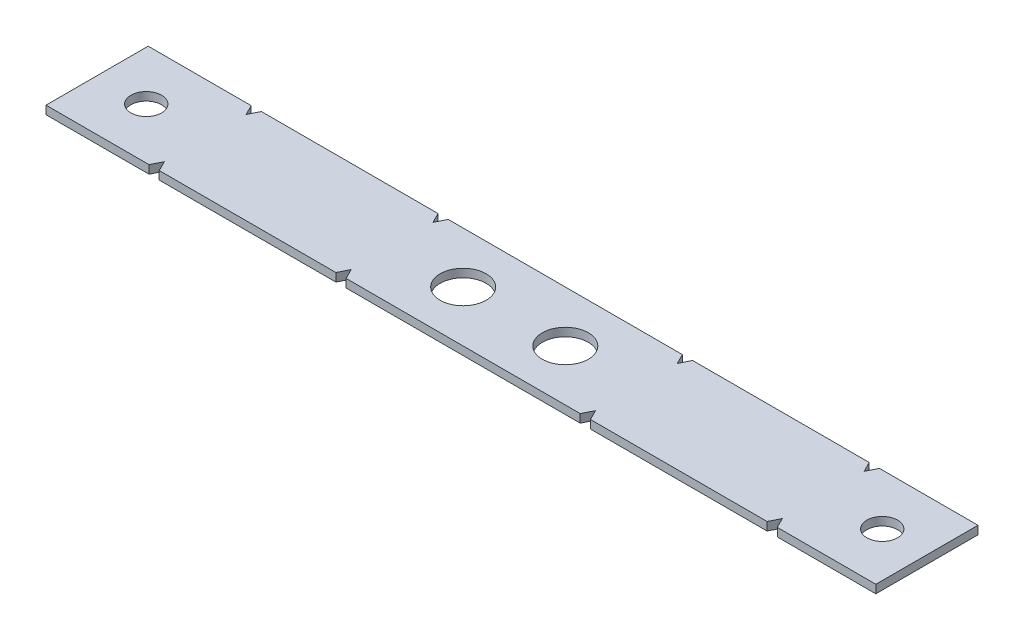
ISO-10303-21;
HEADER;
FILE_DESCRIPTION(('STEP AP214'),'2;1');
FILE_NAME('part.step','',(''),(''),'','','');
FILE_SCHEMA(('AUTOMOTIVE_DESIGN { 1 0 10303 214 1 1 1 1 }'));
ENDSEC;
DATA;
#1=APPLICATION_CONTEXT('core data for automotive mechanical design processes');
#2=APPLICATION_PROTOCOL_DEFINITION('international standard','automotive_design',2000,#1);
#3=PRODUCT_CONTEXT('',#1,'mechanical');
#4=PRODUCT('Part','Part','',(#3));
#5=PRODUCT_RELATED_PRODUCT_CATEGORY('part','',(#4));
#6=PRODUCT_DEFINITION_FORMATION('','',#4);
#7=PRODUCT_DEFINITION_CONTEXT('part definition',#1,'design');
#8=PRODUCT_DEFINITION('design','',#6,#7);
#9=PRODUCT_DEFINITION_SHAPE('','',#8);
#10=(LENGTH_UNIT() NAMED_UNIT(*) SI_UNIT(.MILLI.,.METRE.));
#11=(NAMED_UNIT(*) PLANE_ANGLE_UNIT() SI_UNIT($,.RADIAN.));
#12=(NAMED_UNIT(*) SI_UNIT($,.STERADIAN.) SOLID_ANGLE_UNIT());
#13=UNCERTAINTY_MEASURE_WITH_UNIT(LENGTH_MEASURE(1.E-05),#10,'distance_accuracy_value','');
#14=(GEOMETRIC_REPRESENTATION_CONTEXT(3) GLOBAL_UNCERTAINTY_ASSIGNED_CONTEXT((#13)) GLOBAL_UNIT_ASSIGNED_CONTEXT((#10,
#11,#12)) REPRESENTATION_CONTEXT('',''));
#15=CARTESIAN_POINT('',(0.,0.,0.));
#16=DIRECTION('',(0.,0.,1.));
#17=DIRECTION('',(1.,0.,0.));
#18=AXIS2_PLACEMENT_3D('',#15,#16,#17);
#19=CARTESIAN_POINT('',(0.,0.,0.));
#20=DIRECTION('',(0.,0.,-1.));
#21=DIRECTION('',(1.,0.,0.));
#22=AXIS2_PLACEMENT_3D('',#19,#20,#21);
#23=PLANE('',#22);
#24=DIRECTION('',(0.,-1.,0.));
#25=VECTOR('',#24,1.);
#26=CARTESIAN_POINT('',(-19.7470723224425,0.,0.));
#27=LINE('',#26,#25);
#28=CARTESIAN_POINT('',(-19.7470723224425,0.8128,0.));
#29=VERTEX_POINT('',#28);
#30=CARTESIAN_POINT('',(-19.7470723224425,0.,0.));
#31=VERTEX_POINT('',#30);
#32=EDGE_CURVE('E494',#29,#31,#27,.T.);
#33=ORIENTED_EDGE('',*,*,#32,.F.);
#34=DIRECTION('',(1.,0.,0.));
#35=VECTOR('',#34,1.);
#36=CARTESIAN_POINT('',(0.,0.8128,0.));
#37=LINE('',#36,#35);
#38=CARTESIAN_POINT('',(-29.8302297632567,0.812799999999876,0.));
#39=VERTEX_POINT('',#38);
#40=EDGE_CURVE('E331',#39,#29,#37,.T.);
#41=ORIENTED_EDGE('',*,*,#40,.F.);
#42=DIRECTION('',(0.,-1.,0.));
#43=VECTOR('',#42,1.);
#44=CARTESIAN_POINT('',(-29.8302297632567,0.812799999999876,0.));
#45=LINE('',#44,#43);
#46=CARTESIAN_POINT('',(-29.8302297632567,-1.22948526359856E-13,0.));
#47=VERTEX_POINT('',#46);
#48=EDGE_CURVE('E415',#39,#47,#45,.T.);
#49=ORIENTED_EDGE('',*,*,#48,.T.);
#50=DIRECTION('',(1.,0.,0.));
#51=VECTOR('',#50,1.);
#52=CARTESIAN_POINT('',(0.,0.,0.));
#53=LINE('',#52,#51);
#54=EDGE_CURVE('E13',#47,#31,#53,.T.);
#55=ORIENTED_EDGE('',*,*,#54,.T.);
#56=EDGE_LOOP('',(#33,#41,#49,#55));
#57=FACE_BOUND('',#56,.T.);
#58=ADVANCED_FACE('F95',(#57),#23,.F.);
#59=DIRECTION('',(0.,-1.,0.));
#60=VECTOR('',#59,1.);
#61=CARTESIAN_POINT('',(22.4575574408142,0.,0.));
#62=LINE('',#61,#60);
#63=CARTESIAN_POINT('',(22.4575574408142,0.8128,0.));
#64=VERTEX_POINT('',#63);
#65=CARTESIAN_POINT('',(22.4575574408142,0.,0.));
#66=VERTEX_POINT('',#65);
#67=EDGE_CURVE('E468',#64,#66,#62,.T.);
#68=ORIENTED_EDGE('',*,*,#67,.F.);
#69=CARTESIAN_POINT('',(-0.457557440814174,0.8128,0.));
#70=VERTEX_POINT('',#69);
#71=EDGE_CURVE('E342',#70,#64,#37,.T.);
#72=ORIENTED_EDGE('',*,*,#71,.F.);
#73=DIRECTION('',(0.,-1.,0.));
#74=VECTOR('',#73,1.);
#75=CARTESIAN_POINT('',(-0.457557440814174,0.,0.));
#76=LINE('',#75,#74);
#77=CARTESIAN_POINT('',(-0.457557440814174,0.,0.));
#78=VERTEX_POINT('',#77);
#79=EDGE_CURVE('E558',#70,#78,#76,.T.);
#80=ORIENTED_EDGE('',*,*,#79,.T.);
#81=EDGE_CURVE('E642',#78,#66,#53,.T.);
#82=ORIENTED_EDGE('',*,*,#81,.T.);
#83=EDGE_LOOP('',(#68,#72,#80,#82));
#84=FACE_BOUND('',#83,.T.);
#85=ADVANCED_FACE('F690',(#84),#23,.F.);
#86=DIRECTION('',(0.,-1.,0.));
#87=VECTOR('',#86,1.);
#88=CARTESIAN_POINT('',(-18.7470723224425,0.,0.));
#89=LINE('',#88,#87);
#90=CARTESIAN_POINT('',(-18.7470723224425,0.8128,0.));
#91=VERTEX_POINT('',#90);
#92=CARTESIAN_POINT('',(-18.7470723224425,0.,0.));
#93=VERTEX_POINT('',#92);
#94=EDGE_CURVE('E488',#91,#93,#89,.T.);
#95=ORIENTED_EDGE('',*,*,#94,.T.);
#96=CARTESIAN_POINT('',(-1.45755744081417,0.,0.));
#97=VERTEX_POINT('',#96);
#98=EDGE_CURVE('E105',#93,#97,#53,.T.);
#99=ORIENTED_EDGE('',*,*,#98,.T.);
#100=DIRECTION('',(0.,-1.,0.));
#101=VECTOR('',#100,1.);
#102=CARTESIAN_POINT('',(-1.45755744081417,0.,0.));
#103=LINE('',#102,#101);
#104=CARTESIAN_POINT('',(-1.45755744081417,0.8128,0.));
#105=VERTEX_POINT('',#104);
#106=EDGE_CURVE('E564',#105,#97,#103,.T.);
#107=ORIENTED_EDGE('',*,*,#106,.F.);
#108=EDGE_CURVE('E334',#91,#105,#37,.T.);
#109=ORIENTED_EDGE('',*,*,#108,.F.);
#110=EDGE_LOOP('',(#95,#99,#107,#109));
#111=FACE_BOUND('',#110,.T.);
#112=ADVANCED_FACE('F655',(#111),#23,.F.);
#113=DIRECTION('',(0.,-1.,0.));
#114=VECTOR('',#113,1.);
#115=CARTESIAN_POINT('',(23.4575574408142,0.,0.));
#116=LINE('',#115,#114);
#117=CARTESIAN_POINT('',(23.4575574408142,0.8128,0.));
#118=VERTEX_POINT('',#117);
#119=CARTESIAN_POINT('',(23.4575574408142,0.,0.));
#120=VERTEX_POINT('',#119);
#121=EDGE_CURVE('E122',#118,#120,#116,.T.);
#122=ORIENTED_EDGE('',*,*,#121,.T.);
#123=CARTESIAN_POINT('',(40.7470723224425,0.,0.));
#124=VERTEX_POINT('',#123);
#125=EDGE_CURVE('E639',#120,#124,#53,.T.);
#126=ORIENTED_EDGE('',*,*,#125,.T.);
#127=DIRECTION('',(0.,-1.,0.));
#128=VECTOR('',#127,1.);
#129=CARTESIAN_POINT('',(40.7470723224425,0.,0.));
#130=LINE('',#129,#128);
#131=CARTESIAN_POINT('',(40.7470723224425,0.8128,0.));
#132=VERTEX_POINT('',#131);
#133=EDGE_CURVE('E439',#132,#124,#130,.T.);
#134=ORIENTED_EDGE('',*,*,#133,.F.);
#135=EDGE_CURVE('E344',#118,#132,#37,.T.);
#136=ORIENTED_EDGE('',*,*,#135,.F.);
#137=EDGE_LOOP('',(#122,#126,#134,#136));
#138=FACE_BOUND('',#137,.T.);
#139=ADVANCED_FACE('F699',(#138),#23,.F.);
#140=CARTESIAN_POINT('',(0.,0.,-10.));
#141=DIRECTION('',(0.,0.,1.));
#142=DIRECTION('',(-1.,0.,0.));
#143=AXIS2_PLACEMENT_3D('',#140,#141,#142);
#144=PLANE('',#143);
#145=DIRECTION('',(0.,-1.,0.));
#146=VECTOR('',#145,1.);
#147=CARTESIAN_POINT('',(41.7470723224425,0.,-10.));
#148=LINE('',#147,#146);
#149=CARTESIAN_POINT('',(41.7470723224425,0.8128,-10.));
#150=VERTEX_POINT('',#149);
#151=CARTESIAN_POINT('',(41.7470723224425,0.,-10.));
#152=VERTEX_POINT('',#151);
#153=EDGE_CURVE('E458',#150,#152,#148,.T.);
#154=ORIENTED_EDGE('',*,*,#153,.F.);
#155=DIRECTION('',(1.,0.,0.));
#156=VECTOR('',#155,1.);
#157=CARTESIAN_POINT('',(0.,0.8128,-10.));
#158=LINE('',#157,#156);
#159=CARTESIAN_POINT('',(51.3918297632567,0.812799999999878,-9.99999999999999));
#160=VERTEX_POINT('',#159);
#161=EDGE_CURVE('E99',#160,#150,#158,.F.);
#162=ORIENTED_EDGE('',*,*,#161,.F.);
#163=DIRECTION('',(0.,-1.,0.));
#164=VECTOR('',#163,1.);
#165=CARTESIAN_POINT('',(51.3918297632567,0.812799999999878,-9.99999999999999));
#166=LINE('',#165,#164);
#167=CARTESIAN_POINT('',(51.3918297632567,-1.21430643318376E-13,-9.99999999999999));
#168=VERTEX_POINT('',#167);
#169=EDGE_CURVE('E385',#160,#168,#166,.T.);
#170=ORIENTED_EDGE('',*,*,#169,.T.);
#171=DIRECTION('',(-1.,0.,0.));
#172=VECTOR('',#171,1.);
#173=CARTESIAN_POINT('',(0.,0.,-10.));
#174=LINE('',#173,#172);
#175=EDGE_CURVE('E323',#168,#152,#174,.T.);
#176=ORIENTED_EDGE('',*,*,#175,.T.);
#177=EDGE_LOOP('',(#154,#162,#170,#176));
#178=FACE_BOUND('',#177,.T.);
#179=ADVANCED_FACE('F634',(#178),#144,.F.);
#180=DIRECTION('',(0.,-1.,0.));
#181=VECTOR('',#180,1.);
#182=CARTESIAN_POINT('',(-18.7470723224425,0.,-10.));
#183=LINE('',#182,#181);
#184=CARTESIAN_POINT('',(-18.7470723224425,0.8128,-10.));
#185=VERTEX_POINT('',#184);
#186=CARTESIAN_POINT('',(-18.7470723224425,0.,-10.));
#187=VERTEX_POINT('',#186);
#188=EDGE_CURVE('E518',#185,#187,#183,.T.);
#189=ORIENTED_EDGE('',*,*,#188,.F.);
#190=CARTESIAN_POINT('',(-1.45755744081417,0.8128,-10.));
#191=VERTEX_POINT('',#190);
#192=EDGE_CURVE('E358',#191,#185,#158,.F.);
#193=ORIENTED_EDGE('',*,*,#192,.F.);
#194=DIRECTION('',(0.,-1.,0.));
#195=VECTOR('',#194,1.);
#196=CARTESIAN_POINT('',(-1.45755744081417,0.,-10.));
#197=LINE('',#196,#195);
#198=CARTESIAN_POINT('',(-1.45755744081417,0.,-10.));
#199=VERTEX_POINT('',#198);
#200=EDGE_CURVE('E584',#191,#199,#197,.T.);
#201=ORIENTED_EDGE('',*,*,#200,.T.);
#202=EDGE_CURVE('E318',#199,#187,#174,.T.);
#203=ORIENTED_EDGE('',*,*,#202,.T.);
#204=EDGE_LOOP('',(#189,#193,#201,#203));
#205=FACE_BOUND('',#204,.T.);
#206=ADVANCED_FACE('F710',(#205),#144,.F.);
#207=DIRECTION('',(0.,-1.,0.));
#208=VECTOR('',#207,1.);
#209=CARTESIAN_POINT('',(40.7470723224425,0.,-10.));
#210=LINE('',#209,#208);
#211=CARTESIAN_POINT('',(40.7470723224425,0.8128,-10.));
#212=VERTEX_POINT('',#211);
#213=CARTESIAN_POINT('',(40.7470723224425,0.,-10.));
#214=VERTEX_POINT('',#213);
#215=EDGE_CURVE('E536',#212,#214,#210,.T.);
#216=ORIENTED_EDGE('',*,*,#215,.T.);
#217=CARTESIAN_POINT('',(23.4575574408142,0.,-10.));
#218=VERTEX_POINT('',#217);
#219=EDGE_CURVE('E317',#214,#218,#174,.T.);
#220=ORIENTED_EDGE('',*,*,#219,.T.);
#221=DIRECTION('',(0.,-1.,0.));
#222=VECTOR('',#221,1.);
#223=CARTESIAN_POINT('',(23.4575574408142,0.,-10.));
#224=LINE('',#223,#222);
#225=CARTESIAN_POINT('',(23.4575574408142,0.8128,-10.));
#226=VERTEX_POINT('',#225);
#227=EDGE_CURVE('E482',#226,#218,#224,.T.);
#228=ORIENTED_EDGE('',*,*,#227,.F.);
#229=EDGE_CURVE('E352',#212,#226,#158,.F.);
#230=ORIENTED_EDGE('',*,*,#229,.F.);
#231=EDGE_LOOP('',(#216,#220,#228,#230));
#232=FACE_BOUND('',#231,.T.);
#233=ADVANCED_FACE('F623',(#232),#144,.F.);
#234=DIRECTION('',(0.,-1.,0.));
#235=VECTOR('',#234,1.);
#236=CARTESIAN_POINT('',(22.4575574408142,0.,-10.));
#237=LINE('',#236,#235);
#238=CARTESIAN_POINT('',(22.4575574408142,0.8128,-10.));
#239=VERTEX_POINT('',#238);
#240=CARTESIAN_POINT('',(22.4575574408142,0.,-10.));
#241=VERTEX_POINT('',#240);
#242=EDGE_CURVE('E289',#239,#241,#237,.T.);
#243=ORIENTED_EDGE('',*,*,#242,.T.);
#244=CARTESIAN_POINT('',(-0.457557440814174,0.,-10.));
#245=VERTEX_POINT('',#244);
#246=EDGE_CURVE('E305',#241,#245,#174,.T.);
#247=ORIENTED_EDGE('',*,*,#246,.T.);
#248=DIRECTION('',(0.,-1.,0.));
#249=VECTOR('',#248,1.);
#250=CARTESIAN_POINT('',(-0.457557440814174,0.,-10.));
#251=LINE('',#250,#249);
#252=CARTESIAN_POINT('',(-0.457557440814174,0.8128,-10.));
#253=VERTEX_POINT('',#252);
#254=EDGE_CURVE('E589',#253,#245,#251,.T.);
#255=ORIENTED_EDGE('',*,*,#254,.F.);
#256=EDGE_CURVE('E307',#239,#253,#158,.F.);
#257=ORIENTED_EDGE('',*,*,#256,.F.);
#258=EDGE_LOOP('',(#243,#247,#255,#257));
#259=FACE_BOUND('',#258,.T.);
#260=ADVANCED_FACE('F303',(#259),#144,.F.);
#261=DIRECTION('',(0.,-1.,0.));
#262=VECTOR('',#261,1.);
#263=CARTESIAN_POINT('',(41.7470723224425,0.,0.));
#264=LINE('',#263,#262);
#265=CARTESIAN_POINT('',(41.7470723224425,0.8128,0.));
#266=VERTEX_POINT('',#265);
#267=CARTESIAN_POINT('',(41.7470723224425,0.,0.));
#268=VERTEX_POINT('',#267);
#269=EDGE_CURVE('E114',#266,#268,#264,.T.);
#270=ORIENTED_EDGE('',*,*,#269,.T.);
#271=CARTESIAN_POINT('',(51.3918297632567,-1.2490009027033E-13,0.));
#272=VERTEX_POINT('',#271);
#273=EDGE_CURVE('E107',#268,#272,#53,.T.);
#274=ORIENTED_EDGE('',*,*,#273,.T.);
#275=DIRECTION('',(0.,-1.,0.));
#276=VECTOR('',#275,1.);
#277=CARTESIAN_POINT('',(51.3918297632567,0.812799999999874,0.));
#278=LINE('',#277,#276);
#279=CARTESIAN_POINT('',(51.3918297632567,0.812799999999874,0.));
#280=VERTEX_POINT('',#279);
#281=EDGE_CURVE('E403',#280,#272,#278,.T.);
#282=ORIENTED_EDGE('',*,*,#281,.F.);
#283=EDGE_CURVE('E335',#266,#280,#37,.T.);
#284=ORIENTED_EDGE('',*,*,#283,.F.);
#285=EDGE_LOOP('',(#270,#274,#282,#284));
#286=FACE_BOUND('',#285,.T.);
#287=ADVANCED_FACE('F692',(#286),#23,.F.);
#288=DIRECTION('',(0.,-1.,0.));
#289=VECTOR('',#288,1.);
#290=CARTESIAN_POINT('',(-19.7470723224425,0.,-10.));
#291=LINE('',#290,#289);
#292=CARTESIAN_POINT('',(-19.7470723224425,0.8128,-10.));
#293=VERTEX_POINT('',#292);
#294=CARTESIAN_POINT('',(-19.7470723224425,0.,-10.));
#295=VERTEX_POINT('',#294);
#296=EDGE_CURVE('E512',#293,#295,#291,.T.);
#297=ORIENTED_EDGE('',*,*,#296,.T.);
#298=CARTESIAN_POINT('',(-29.8302297632567,-1.2641797331181E-13,-10.));
#299=VERTEX_POINT('',#298);
#300=EDGE_CURVE('E325',#295,#299,#174,.T.);
#301=ORIENTED_EDGE('',*,*,#300,.T.);
#302=DIRECTION('',(0.,-1.,0.));
#303=VECTOR('',#302,1.);
#304=CARTESIAN_POINT('',(-29.8302297632567,0.812799999999873,-10.));
#305=LINE('',#304,#303);
#306=CARTESIAN_POINT('',(-29.8302297632567,0.812799999999873,-10.));
#307=VERTEX_POINT('',#306);
#308=EDGE_CURVE('E431',#307,#299,#305,.T.);
#309=ORIENTED_EDGE('',*,*,#308,.F.);
#310=EDGE_CURVE('E353',#293,#307,#158,.F.);
#311=ORIENTED_EDGE('',*,*,#310,.F.);
#312=EDGE_LOOP('',(#297,#301,#309,#311));
#313=FACE_BOUND('',#312,.T.);
#314=ADVANCED_FACE('F698',(#313),#144,.F.);
#315=CARTESIAN_POINT('',(0.,0.,0.));
#316=DIRECTION('',(0.,-1.,0.));
#317=DIRECTION('',(0.,0.,-1.));
#318=AXIS2_PLACEMENT_3D('',#315,#316,#317);
#319=PLANE('',#318);
#320=DIRECTION('',(-0.447213595499956,0.,0.894427190999917));
#321=VECTOR('',#320,1.);
#322=CARTESIAN_POINT('',(41.7470723224425,0.,-10.));
#323=LINE('',#322,#321);
#324=CARTESIAN_POINT('',(41.2470723224425,0.,-8.99999999999999));
#325=VERTEX_POINT('',#324);
#326=EDGE_CURVE('E541',#152,#325,#323,.T.);
#327=ORIENTED_EDGE('',*,*,#326,.F.);
#328=ORIENTED_EDGE('',*,*,#175,.F.);
#329=DIRECTION('',(0.,0.,-1.));
#330=VECTOR('',#329,1.);
#331=CARTESIAN_POINT('',(51.3918297632567,-1.21430643318376E-13,-9.99999999999999));
#332=LINE('',#331,#330);
#333=EDGE_CURVE('E406',#272,#168,#332,.T.);
#334=ORIENTED_EDGE('',*,*,#333,.F.);
#335=ORIENTED_EDGE('',*,*,#273,.F.);
#336=DIRECTION('',(0.447213595499959,0.,0.894427190999915));
#337=VECTOR('',#336,1.);
#338=CARTESIAN_POINT('',(41.2470723224425,0.,-0.999999999999996));
#339=LINE('',#338,#337);
#340=CARTESIAN_POINT('',(41.2470723224425,0.,-0.999999999999996));
#341=VERTEX_POINT('',#340);
#342=EDGE_CURVE('E454',#341,#268,#339,.T.);
#343=ORIENTED_EDGE('',*,*,#342,.F.);
#344=DIRECTION('',(0.447213595499959,0.,-0.894427190999915));
#345=VECTOR('',#344,1.);
#346=CARTESIAN_POINT('',(40.7470723224425,0.,0.));
#347=LINE('',#346,#345);
#348=EDGE_CURVE('E461',#124,#341,#347,.T.);
#349=ORIENTED_EDGE('',*,*,#348,.F.);
#350=ORIENTED_EDGE('',*,*,#125,.F.);
#351=DIRECTION('',(0.447213595499958,0.,0.894427190999916));
#352=VECTOR('',#351,1.);
#353=CARTESIAN_POINT('',(22.9575574408142,0.,-1.));
#354=LINE('',#353,#352);
#355=CARTESIAN_POINT('',(22.9575574408142,0.,-1.));
#356=VERTEX_POINT('',#355);
#357=EDGE_CURVE('E478',#356,#120,#354,.T.);
#358=ORIENTED_EDGE('',*,*,#357,.F.);
#359=DIRECTION('',(0.447213595499958,0.,-0.894427190999916));
#360=VECTOR('',#359,1.);
#361=CARTESIAN_POINT('',(22.4575574408142,0.,0.));
#362=LINE('',#361,#360);
#363=EDGE_CURVE('E467',#66,#356,#362,.T.);
#364=ORIENTED_EDGE('',*,*,#363,.F.);
#365=ORIENTED_EDGE('',*,*,#81,.F.);
#366=DIRECTION('',(0.447213595499958,0.,0.894427190999916));
#367=VECTOR('',#366,1.);
#368=CARTESIAN_POINT('',(-0.957557440814174,0.,-0.999999999999999));
#369=LINE('',#368,#367);
#370=CARTESIAN_POINT('',(-0.957557440814174,0.,-0.999999999999999));
#371=VERTEX_POINT('',#370);
#372=EDGE_CURVE('E574',#371,#78,#369,.T.);
#373=ORIENTED_EDGE('',*,*,#372,.F.);
#374=DIRECTION('',(0.447213595499958,0.,-0.894427190999916));
#375=VECTOR('',#374,1.);
#376=CARTESIAN_POINT('',(-1.45755744081417,0.,0.));
#377=LINE('',#376,#375);
#378=EDGE_CURVE('E563',#97,#371,#377,.T.);
#379=ORIENTED_EDGE('',*,*,#378,.F.);
#380=ORIENTED_EDGE('',*,*,#98,.F.);
#381=DIRECTION('',(0.44721359549996,0.,0.894427190999915));
#382=VECTOR('',#381,1.);
#383=CARTESIAN_POINT('',(-19.2470723224425,0.,-1.));
#384=LINE('',#383,#382);
#385=CARTESIAN_POINT('',(-19.2470723224425,0.,-1.));
#386=VERTEX_POINT('',#385);
#387=EDGE_CURVE('E503',#386,#93,#384,.T.);
#388=ORIENTED_EDGE('',*,*,#387,.F.);
#389=DIRECTION('',(0.44721359549996,0.,-0.894427190999915));
#390=VECTOR('',#389,1.);
#391=CARTESIAN_POINT('',(-19.7470723224425,0.,0.));
#392=LINE('',#391,#390);
#393=EDGE_CURVE('E493',#31,#386,#392,.T.);
#394=ORIENTED_EDGE('',*,*,#393,.F.);
#395=ORIENTED_EDGE('',*,*,#54,.F.);
#396=DIRECTION('',(0.,0.,1.));
#397=VECTOR('',#396,1.);
#398=CARTESIAN_POINT('',(-29.8302297632567,-1.22948526359856E-13,0.));
#399=LINE('',#398,#397);
#400=EDGE_CURVE('E394',#299,#47,#399,.T.);
#401=ORIENTED_EDGE('',*,*,#400,.F.);
#402=ORIENTED_EDGE('',*,*,#300,.F.);
#403=DIRECTION('',(-0.447213595499957,0.,-0.894427190999916));
#404=VECTOR('',#403,1.);
#405=CARTESIAN_POINT('',(-19.2470723224425,0.,-9.00000000000001));
#406=LINE('',#405,#404);
#407=CARTESIAN_POINT('',(-19.2470723224425,0.,-9.00000000000001));
#408=VERTEX_POINT('',#407);
#409=EDGE_CURVE('E528',#408,#295,#406,.T.);
#410=ORIENTED_EDGE('',*,*,#409,.F.);
#411=DIRECTION('',(-0.447213595499957,0.,0.894427190999916));
#412=VECTOR('',#411,1.);
#413=CARTESIAN_POINT('',(-18.7470723224425,0.,-10.));
#414=LINE('',#413,#412);
#415=EDGE_CURVE('E517',#187,#408,#414,.T.);
#416=ORIENTED_EDGE('',*,*,#415,.F.);
#417=ORIENTED_EDGE('',*,*,#202,.F.);
#418=DIRECTION('',(-0.447213595499958,0.,-0.894427190999916));
#419=VECTOR('',#418,1.);
#420=CARTESIAN_POINT('',(-0.957557440814174,0.,-9.));
#421=LINE('',#420,#419);
#422=CARTESIAN_POINT('',(-0.957557440814174,0.,-9.));
#423=VERTEX_POINT('',#422);
#424=EDGE_CURVE('E599',#423,#199,#421,.T.);
#425=ORIENTED_EDGE('',*,*,#424,.F.);
#426=DIRECTION('',(-0.447213595499958,0.,0.894427190999916));
#427=VECTOR('',#426,1.);
#428=CARTESIAN_POINT('',(-0.457557440814174,0.,-10.));
#429=LINE('',#428,#427);
#430=EDGE_CURVE('E315',#245,#423,#429,.T.);
#431=ORIENTED_EDGE('',*,*,#430,.F.);
#432=ORIENTED_EDGE('',*,*,#246,.F.);
#433=DIRECTION('',(-0.447213595499959,0.,-0.894427190999916));
#434=VECTOR('',#433,1.);
#435=CARTESIAN_POINT('',(22.9575574408142,0.,-9.));
#436=LINE('',#435,#434);
#437=CARTESIAN_POINT('',(22.9575574408142,0.,-9.));
#438=VERTEX_POINT('',#437);
#439=EDGE_CURVE('E285',#438,#241,#436,.T.);
#440=ORIENTED_EDGE('',*,*,#439,.F.);
#441=DIRECTION('',(-0.447213595499959,0.,0.894427190999916));
#442=VECTOR('',#441,1.);
#443=CARTESIAN_POINT('',(23.4575574408142,0.,-10.));
#444=LINE('',#443,#442);
#445=EDGE_CURVE('E297',#218,#438,#444,.T.);
#446=ORIENTED_EDGE('',*,*,#445,.F.);
#447=ORIENTED_EDGE('',*,*,#219,.F.);
#448=DIRECTION('',(-0.447213595499956,0.,-0.894427190999917));
#449=VECTOR('',#448,1.);
#450=CARTESIAN_POINT('',(41.2470723224425,0.,-8.99999999999999));
#451=LINE('',#450,#449);
#452=EDGE_CURVE('E549',#325,#214,#451,.T.);
#453=ORIENTED_EDGE('',*,*,#452,.F.);
#454=EDGE_LOOP('',(#327,#328,#334,#335,#343,#349,#350,#358,#364,#365,#373,#379,#380,#388,#394,
#395,#401,#402,#410,#416,#417,#425,#431,#432,#440,#446,#447,#453));
#455=FACE_BOUND('',#454,.T.);
#456=CARTESIAN_POINT('',(6.,0.,-5.));
#457=DIRECTION('',(0.,-1.,0.));
#458=DIRECTION('',(0.,0.,-1.));
#459=AXIS2_PLACEMENT_3D('',#456,#457,#458);
#460=CIRCLE('',#459,2.25);
#461=CARTESIAN_POINT('',(6.,0.,-7.25));
#462=VERTEX_POINT('',#461);
#463=EDGE_CURVE('E367',#462,#462,#460,.T.);
#464=ORIENTED_EDGE('',*,*,#463,.F.);
#465=EDGE_LOOP('',(#464));
#466=FACE_BOUND('',#465,.T.);
#467=CARTESIAN_POINT('',(16.,0.,-5.));
#468=DIRECTION('',(0.,-1.,0.));
#469=DIRECTION('',(0.,0.,-1.));
#470=AXIS2_PLACEMENT_3D('',#467,#468,#469);
#471=CIRCLE('',#470,2.25);
#472=CARTESIAN_POINT('',(16.,0.,-7.25));
#473=VERTEX_POINT('',#472);
#474=EDGE_CURVE('E329',#473,#473,#471,.T.);
#475=ORIENTED_EDGE('',*,*,#474,.F.);
#476=EDGE_LOOP('',(#475));
#477=FACE_BOUND('',#476,.T.);
#478=CARTESIAN_POINT('',(47.0174297632567,-1.2490009027033E-13,-5.00000000000001));
#479=DIRECTION('',(0.,-1.,0.));
#480=DIRECTION('',(0.,0.,-1.));
#481=AXIS2_PLACEMENT_3D('',#478,#479,#480);
#482=CIRCLE('',#481,1.5);
#483=CARTESIAN_POINT('',(47.0174297632567,-1.24379673227537E-13,-6.50000000000001));
#484=VERTEX_POINT('',#483);
#485=EDGE_CURVE('E378',#484,#484,#482,.F.);
#486=ORIENTED_EDGE('',*,*,#485,.T.);
#487=EDGE_LOOP('',(#486));
#488=FACE_BOUND('',#487,.T.);
#489=CARTESIAN_POINT('',(-25.0174297632567,-1.26851654180804E-13,-5.00000000000001));
#490=DIRECTION('',(0.,-1.,0.));
#491=DIRECTION('',(0.,0.,-1.));
#492=AXIS2_PLACEMENT_3D('',#489,#490,#491);
#493=CIRCLE('',#492,1.5);
#494=CARTESIAN_POINT('',(-25.0174297632567,-1.27372071223597E-13,-6.50000000000001));
#495=VERTEX_POINT('',#494);
#496=EDGE_CURVE('E409',#495,#495,#493,.F.);
#497=ORIENTED_EDGE('',*,*,#496,.T.);
#498=EDGE_LOOP('',(#497));
#499=FACE_BOUND('',#498,.T.);
#500=ADVANCED_FACE('F97',(#455,#466,#477,#488,#499),#319,.T.);
#501=CARTESIAN_POINT('',(0.,0.8128,0.));
#502=DIRECTION('',(0.,-1.,0.));
#503=DIRECTION('',(0.,0.,-1.));
#504=AXIS2_PLACEMENT_3D('',#501,#502,#503);
#505=PLANE('',#504);
#506=CARTESIAN_POINT('',(6.,0.812799999999999,-5.));
#507=DIRECTION('',(0.,-1.,0.));
#508=DIRECTION('',(0.,0.,-1.));
#509=AXIS2_PLACEMENT_3D('',#506,#507,#508);
#510=CIRCLE('',#509,2.25);
#511=CARTESIAN_POINT('',(6.,0.812799999999999,-7.25));
#512=VERTEX_POINT('',#511);
#513=EDGE_CURVE('E359',#512,#512,#510,.F.);
#514=ORIENTED_EDGE('',*,*,#513,.F.);
#515=EDGE_LOOP('',(#514));
#516=FACE_BOUND('',#515,.T.);
#517=CARTESIAN_POINT('',(16.,0.812799999999999,-5.));
#518=DIRECTION('',(0.,-1.,0.));
#519=DIRECTION('',(0.,0.,-1.));
#520=AXIS2_PLACEMENT_3D('',#517,#518,#519);
#521=CIRCLE('',#520,2.25);
#522=CARTESIAN_POINT('',(16.,0.812799999999999,-7.25));
#523=VERTEX_POINT('',#522);
#524=EDGE_CURVE('E375',#523,#523,#521,.F.);
#525=ORIENTED_EDGE('',*,*,#524,.F.);
#526=EDGE_LOOP('',(#525));
#527=FACE_BOUND('',#526,.T.);
#528=ORIENTED_EDGE('',*,*,#161,.T.);
#529=DIRECTION('',(-0.447213595499956,0.,0.894427190999917));
#530=VECTOR('',#529,1.);
#531=CARTESIAN_POINT('',(41.7470723224425,0.8128,-10.));
#532=LINE('',#531,#530);
#533=CARTESIAN_POINT('',(41.2470723224425,0.8128,-8.99999999999999));
#534=VERTEX_POINT('',#533);
#535=EDGE_CURVE('E546',#150,#534,#532,.T.);
#536=ORIENTED_EDGE('',*,*,#535,.T.);
#537=DIRECTION('',(-0.447213595499956,0.,-0.894427190999917));
#538=VECTOR('',#537,1.);
#539=CARTESIAN_POINT('',(41.2470723224425,0.8128,-8.99999999999999));
#540=LINE('',#539,#538);
#541=EDGE_CURVE('E521',#534,#212,#540,.T.);
#542=ORIENTED_EDGE('',*,*,#541,.T.);
#543=ORIENTED_EDGE('',*,*,#229,.T.);
#544=DIRECTION('',(-0.447213595499959,0.,0.894427190999916));
#545=VECTOR('',#544,1.);
#546=CARTESIAN_POINT('',(23.4575574408142,0.8128,-10.));
#547=LINE('',#546,#545);
#548=CARTESIAN_POINT('',(22.9575574408142,0.8128,-9.));
#549=VERTEX_POINT('',#548);
#550=EDGE_CURVE('E298',#226,#549,#547,.T.);
#551=ORIENTED_EDGE('',*,*,#550,.T.);
#552=DIRECTION('',(-0.447213595499959,0.,-0.894427190999916));
#553=VECTOR('',#552,1.);
#554=CARTESIAN_POINT('',(22.9575574408142,0.8128,-9.));
#555=LINE('',#554,#553);
#556=EDGE_CURVE('E592',#549,#239,#555,.T.);
#557=ORIENTED_EDGE('',*,*,#556,.T.);
#558=ORIENTED_EDGE('',*,*,#256,.T.);
#559=DIRECTION('',(-0.447213595499958,0.,0.894427190999916));
#560=VECTOR('',#559,1.);
#561=CARTESIAN_POINT('',(-0.457557440814174,0.8128,-10.));
#562=LINE('',#561,#560);
#563=CARTESIAN_POINT('',(-0.957557440814174,0.8128,-9.));
#564=VERTEX_POINT('',#563);
#565=EDGE_CURVE('E595',#253,#564,#562,.T.);
#566=ORIENTED_EDGE('',*,*,#565,.T.);
#567=DIRECTION('',(-0.447213595499958,0.,-0.894427190999916));
#568=VECTOR('',#567,1.);
#569=CARTESIAN_POINT('',(-0.957557440814174,0.8128,-9.));
#570=LINE('',#569,#568);
#571=EDGE_CURVE('E567',#564,#191,#570,.T.);
#572=ORIENTED_EDGE('',*,*,#571,.T.);
#573=ORIENTED_EDGE('',*,*,#192,.T.);
#574=DIRECTION('',(-0.447213595499957,0.,0.894427190999916));
#575=VECTOR('',#574,1.);
#576=CARTESIAN_POINT('',(-18.7470723224425,0.8128,-10.));
#577=LINE('',#576,#575);
#578=CARTESIAN_POINT('',(-19.2470723224425,0.8128,-9.00000000000001));
#579=VERTEX_POINT('',#578);
#580=EDGE_CURVE('E524',#185,#579,#577,.T.);
#581=ORIENTED_EDGE('',*,*,#580,.T.);
#582=DIRECTION('',(-0.447213595499957,0.,-0.894427190999916));
#583=VECTOR('',#582,1.);
#584=CARTESIAN_POINT('',(-19.2470723224425,0.8128,-9.00000000000001));
#585=LINE('',#584,#583);
#586=EDGE_CURVE('E497',#579,#293,#585,.T.);
#587=ORIENTED_EDGE('',*,*,#586,.T.);
#588=ORIENTED_EDGE('',*,*,#310,.T.);
#589=DIRECTION('',(0.,0.,1.));
#590=VECTOR('',#589,1.);
#591=CARTESIAN_POINT('',(-29.8302297632567,0.812799999999876,0.));
#592=LINE('',#591,#590);
#593=EDGE_CURVE('E421',#307,#39,#592,.T.);
#594=ORIENTED_EDGE('',*,*,#593,.T.);
#595=ORIENTED_EDGE('',*,*,#40,.T.);
#596=DIRECTION('',(0.44721359549996,0.,-0.894427190999915));
#597=VECTOR('',#596,1.);
#598=CARTESIAN_POINT('',(-19.7470723224425,0.8128,0.));
#599=LINE('',#598,#597);
#600=CARTESIAN_POINT('',(-19.2470723224425,0.8128,-1.));
#601=VERTEX_POINT('',#600);
#602=EDGE_CURVE('E500',#29,#601,#599,.T.);
#603=ORIENTED_EDGE('',*,*,#602,.T.);
#604=DIRECTION('',(0.44721359549996,0.,0.894427190999915));
#605=VECTOR('',#604,1.);
#606=CARTESIAN_POINT('',(-19.2470723224425,0.8128,-1.));
#607=LINE('',#606,#605);
#608=EDGE_CURVE('E471',#601,#91,#607,.T.);
#609=ORIENTED_EDGE('',*,*,#608,.T.);
#610=ORIENTED_EDGE('',*,*,#108,.T.);
#611=DIRECTION('',(0.447213595499958,0.,-0.894427190999916));
#612=VECTOR('',#611,1.);
#613=CARTESIAN_POINT('',(-1.45755744081417,0.8128,0.));
#614=LINE('',#613,#612);
#615=CARTESIAN_POINT('',(-0.957557440814174,0.8128,-0.999999999999999));
#616=VERTEX_POINT('',#615);
#617=EDGE_CURVE('E570',#105,#616,#614,.T.);
#618=ORIENTED_EDGE('',*,*,#617,.T.);
#619=DIRECTION('',(0.447213595499958,0.,0.894427190999916));
#620=VECTOR('',#619,1.);
#621=CARTESIAN_POINT('',(-0.957557440814174,0.8128,-0.999999999999999));
#622=LINE('',#621,#620);
#623=EDGE_CURVE('E575',#616,#70,#622,.T.);
#624=ORIENTED_EDGE('',*,*,#623,.T.);
#625=ORIENTED_EDGE('',*,*,#71,.T.);
#626=DIRECTION('',(0.447213595499958,0.,-0.894427190999916));
#627=VECTOR('',#626,1.);
#628=CARTESIAN_POINT('',(22.4575574408142,0.8128,0.));
#629=LINE('',#628,#627);
#630=CARTESIAN_POINT('',(22.9575574408142,0.8128,-1.));
#631=VERTEX_POINT('',#630);
#632=EDGE_CURVE('E474',#64,#631,#629,.T.);
#633=ORIENTED_EDGE('',*,*,#632,.T.);
#634=DIRECTION('',(0.447213595499958,0.,0.894427190999916));
#635=VECTOR('',#634,1.);
#636=CARTESIAN_POINT('',(22.9575574408142,0.8128,-1.));
#637=LINE('',#636,#635);
#638=EDGE_CURVE('E479',#631,#118,#637,.T.);
#639=ORIENTED_EDGE('',*,*,#638,.T.);
#640=ORIENTED_EDGE('',*,*,#135,.T.);
#641=DIRECTION('',(0.447213595499959,0.,-0.894427190999915));
#642=VECTOR('',#641,1.);
#643=CARTESIAN_POINT('',(40.7470723224425,0.8128,0.));
#644=LINE('',#643,#642);
#645=CARTESIAN_POINT('',(41.2470723224425,0.8128,-0.999999999999996));
#646=VERTEX_POINT('',#645);
#647=EDGE_CURVE('E450',#132,#646,#644,.T.);
#648=ORIENTED_EDGE('',*,*,#647,.T.);
#649=DIRECTION('',(0.447213595499959,0.,0.894427190999915));
#650=VECTOR('',#649,1.);
#651=CARTESIAN_POINT('',(41.2470723224425,0.8128,-0.999999999999996));
#652=LINE('',#651,#650);
#653=EDGE_CURVE('E455',#646,#266,#652,.T.);
#654=ORIENTED_EDGE('',*,*,#653,.T.);
#655=ORIENTED_EDGE('',*,*,#283,.T.);
#656=DIRECTION('',(0.,0.,-1.));
#657=VECTOR('',#656,1.);
#658=CARTESIAN_POINT('',(51.3918297632567,0.812799999999878,-9.99999999999999));
#659=LINE('',#658,#657);
#660=EDGE_CURVE('E391',#280,#160,#659,.T.);
#661=ORIENTED_EDGE('',*,*,#660,.T.);
#662=EDGE_LOOP('',(#528,#536,#542,#543,#551,#557,#558,#566,#572,#573,#581,#587,#588,#594,#595,
#603,#609,#610,#618,#624,#625,#633,#639,#640,#648,#654,#655,#661));
#663=FACE_BOUND('',#662,.T.);
#664=CARTESIAN_POINT('',(47.0174297632567,0.812799999999874,-5.00000000000001));
#665=DIRECTION('',(0.,1.,0.));
#666=DIRECTION('',(0.,0.,-1.));
#667=AXIS2_PLACEMENT_3D('',#664,#665,#666);
#668=CIRCLE('',#667,1.5);
#669=CARTESIAN_POINT('',(47.0174297632567,0.812799999999874,-6.50000000000001));
#670=VERTEX_POINT('',#669);
#671=EDGE_CURVE('E399',#670,#670,#668,.T.);
#672=ORIENTED_EDGE('',*,*,#671,.F.);
#673=EDGE_LOOP('',(#672));
#674=FACE_BOUND('',#673,.T.);
#675=CARTESIAN_POINT('',(-25.0174297632567,0.812799999999876,-5.00000000000001));
#676=DIRECTION('',(0.,1.,0.));
#677=DIRECTION('',(0.,0.,1.));
#678=AXIS2_PLACEMENT_3D('',#675,#676,#677);
#679=CIRCLE('',#678,1.5);
#680=CARTESIAN_POINT('',(-25.0174297632567,0.812799999999876,-3.50000000000001));
#681=VERTEX_POINT('',#680);
#682=EDGE_CURVE('E428',#681,#681,#679,.T.);
#683=ORIENTED_EDGE('',*,*,#682,.F.);
#684=EDGE_LOOP('',(#683));
#685=FACE_BOUND('',#684,.T.);
#686=ADVANCED_FACE('F628',(#516,#527,#663,#674,#685),#505,.F.);
#687=CARTESIAN_POINT('',(16.,19.6266,-5.));
#688=DIRECTION('',(0.,-1.,0.));
#689=DIRECTION('',(0.,0.,-1.));
#690=AXIS2_PLACEMENT_3D('',#687,#688,#689);
#691=CYLINDRICAL_SURFACE('',#690,2.25);
#692=ORIENTED_EDGE('',*,*,#474,.T.);
#693=EDGE_LOOP('',(#692));
#694=FACE_BOUND('',#693,.T.);
#695=ORIENTED_EDGE('',*,*,#524,.T.);
#696=EDGE_LOOP('',(#695));
#697=FACE_BOUND('',#696,.T.);
#698=ADVANCED_FACE('F976',(#694,#697),#691,.F.);
#699=CARTESIAN_POINT('',(6.,19.6266,-5.));
#700=DIRECTION('',(0.,-1.,0.));
#701=DIRECTION('',(0.,0.,-1.));
#702=AXIS2_PLACEMENT_3D('',#699,#700,#701);
#703=CYLINDRICAL_SURFACE('',#702,2.25);
#704=ORIENTED_EDGE('',*,*,#463,.T.);
#705=EDGE_LOOP('',(#704));
#706=FACE_BOUND('',#705,.T.);
#707=ORIENTED_EDGE('',*,*,#513,.T.);
#708=EDGE_LOOP('',(#707));
#709=FACE_BOUND('',#708,.T.);
#710=ADVANCED_FACE('F966',(#706,#709),#703,.F.);
#711=CARTESIAN_POINT('',(51.3918297632567,0.812799999999878,-9.99999999999999));
#712=DIRECTION('',(-1.,0.,0.));
#713=DIRECTION('',(0.,-1.,0.));
#714=AXIS2_PLACEMENT_3D('',#711,#712,#713);
#715=PLANE('',#714);
#716=ORIENTED_EDGE('',*,*,#333,.T.);
#717=ORIENTED_EDGE('',*,*,#169,.F.);
#718=ORIENTED_EDGE('',*,*,#660,.F.);
#719=ORIENTED_EDGE('',*,*,#281,.T.);
#720=EDGE_LOOP('',(#716,#717,#718,#719));
#721=FACE_BOUND('',#720,.T.);
#722=ADVANCED_FACE('F685',(#721),#715,.F.);
#723=CARTESIAN_POINT('',(47.0174297632567,-18.8138000000001,-5.00000000000001));
#724=DIRECTION('',(0.,1.,0.));
#725=DIRECTION('',(0.,0.,1.));
#726=AXIS2_PLACEMENT_3D('',#723,#724,#725);
#727=CYLINDRICAL_SURFACE('',#726,1.5);
#728=ORIENTED_EDGE('',*,*,#485,.F.);
#729=EDGE_LOOP('',(#728));
#730=FACE_BOUND('',#729,.T.);
#731=ORIENTED_EDGE('',*,*,#671,.T.);
#732=EDGE_LOOP('',(#731));
#733=FACE_BOUND('',#732,.T.);
#734=ADVANCED_FACE('F676',(#730,#733),#727,.F.);
#735=CARTESIAN_POINT('',(-29.8302297632567,0.812799999999876,0.));
#736=DIRECTION('',(1.,0.,0.));
#737=DIRECTION('',(0.,0.,-1.));
#738=AXIS2_PLACEMENT_3D('',#735,#736,#737);
#739=PLANE('',#738);
#740=ORIENTED_EDGE('',*,*,#400,.T.);
#741=ORIENTED_EDGE('',*,*,#48,.F.);
#742=ORIENTED_EDGE('',*,*,#593,.F.);
#743=ORIENTED_EDGE('',*,*,#308,.T.);
#744=EDGE_LOOP('',(#740,#741,#742,#743));
#745=FACE_BOUND('',#744,.T.);
#746=ADVANCED_FACE('F673',(#745),#739,.F.);
#747=CARTESIAN_POINT('',(-25.0174297632567,-18.8138000000001,-5.00000000000001));
#748=DIRECTION('',(0.,1.,0.));
#749=DIRECTION('',(0.,0.,1.));
#750=AXIS2_PLACEMENT_3D('',#747,#748,#749);
#751=CYLINDRICAL_SURFACE('',#750,1.5);
#752=ORIENTED_EDGE('',*,*,#496,.F.);
#753=EDGE_LOOP('',(#752));
#754=FACE_BOUND('',#753,.T.);
#755=ORIENTED_EDGE('',*,*,#682,.T.);
#756=EDGE_LOOP('',(#755));
#757=FACE_BOUND('',#756,.T.);
#758=ADVANCED_FACE('F675',(#754,#757),#751,.F.);
#759=CARTESIAN_POINT('',(40.7470723224425,0.,0.));
#760=DIRECTION('',(-0.894427190999915,0.,-0.447213595499959));
#761=DIRECTION('',(0.447213595499959,0.,-0.894427190999915));
#762=AXIS2_PLACEMENT_3D('',#759,#760,#761);
#763=PLANE('',#762);
#764=ORIENTED_EDGE('',*,*,#133,.T.);
#765=ORIENTED_EDGE('',*,*,#348,.T.);
#766=DIRECTION('',(0.,-1.,0.));
#767=VECTOR('',#766,1.);
#768=CARTESIAN_POINT('',(41.2470723224425,0.,-0.999999999999996));
#769=LINE('',#768,#767);
#770=EDGE_CURVE('E442',#646,#341,#769,.T.);
#771=ORIENTED_EDGE('',*,*,#770,.F.);
#772=ORIENTED_EDGE('',*,*,#647,.F.);
#773=EDGE_LOOP('',(#764,#765,#771,#772));
#774=FACE_BOUND('',#773,.T.);
#775=ADVANCED_FACE('F682',(#774),#763,.F.);
#776=CARTESIAN_POINT('',(41.2470723224425,0.,-0.999999999999996));
#777=DIRECTION('',(0.894427190999915,0.,-0.447213595499959));
#778=DIRECTION('',(0.447213595499959,0.,0.894427190999915));
#779=AXIS2_PLACEMENT_3D('',#776,#777,#778);
#780=PLANE('',#779);
#781=ORIENTED_EDGE('',*,*,#770,.T.);
#782=ORIENTED_EDGE('',*,*,#342,.T.);
#783=ORIENTED_EDGE('',*,*,#269,.F.);
#784=ORIENTED_EDGE('',*,*,#653,.F.);
#785=EDGE_LOOP('',(#781,#782,#783,#784));
#786=FACE_BOUND('',#785,.T.);
#787=ADVANCED_FACE('F714',(#786),#780,.F.);
#788=CARTESIAN_POINT('',(-1.45755744081417,0.,0.));
#789=DIRECTION('',(-0.894427190999916,0.,-0.447213595499958));
#790=DIRECTION('',(0.447213595499958,0.,-0.894427190999916));
#791=AXIS2_PLACEMENT_3D('',#788,#789,#790);
#792=PLANE('',#791);
#793=ORIENTED_EDGE('',*,*,#106,.T.);
#794=ORIENTED_EDGE('',*,*,#378,.T.);
#795=DIRECTION('',(0.,-1.,0.));
#796=VECTOR('',#795,1.);
#797=CARTESIAN_POINT('',(-0.957557440814174,0.,-0.999999999999999));
#798=LINE('',#797,#796);
#799=EDGE_CURVE('E562',#616,#371,#798,.T.);
#800=ORIENTED_EDGE('',*,*,#799,.F.);
#801=ORIENTED_EDGE('',*,*,#617,.F.);
#802=EDGE_LOOP('',(#793,#794,#800,#801));
#803=FACE_BOUND('',#802,.T.);
#804=ADVANCED_FACE('F662',(#803),#792,.F.);
#805=CARTESIAN_POINT('',(-0.957557440814174,0.,-0.999999999999999));
#806=DIRECTION('',(0.894427190999916,0.,-0.447213595499958));
#807=DIRECTION('',(0.447213595499958,0.,0.894427190999916));
#808=AXIS2_PLACEMENT_3D('',#805,#806,#807);
#809=PLANE('',#808);
#810=ORIENTED_EDGE('',*,*,#799,.T.);
#811=ORIENTED_EDGE('',*,*,#372,.T.);
#812=ORIENTED_EDGE('',*,*,#79,.F.);
#813=ORIENTED_EDGE('',*,*,#623,.F.);
#814=EDGE_LOOP('',(#810,#811,#812,#813));
#815=FACE_BOUND('',#814,.T.);
#816=ADVANCED_FACE('F720',(#815),#809,.F.);
#817=CARTESIAN_POINT('',(-0.457557440814174,0.,-10.));
#818=DIRECTION('',(0.894427190999916,0.,0.447213595499958));
#819=DIRECTION('',(-0.447213595499958,0.,0.894427190999916));
#820=AXIS2_PLACEMENT_3D('',#817,#818,#819);
#821=PLANE('',#820);
#822=ORIENTED_EDGE('',*,*,#254,.T.);
#823=ORIENTED_EDGE('',*,*,#430,.T.);
#824=DIRECTION('',(0.,-1.,0.));
#825=VECTOR('',#824,1.);
#826=CARTESIAN_POINT('',(-0.957557440814174,0.,-9.));
#827=LINE('',#826,#825);
#828=EDGE_CURVE('E588',#564,#423,#827,.T.);
#829=ORIENTED_EDGE('',*,*,#828,.F.);
#830=ORIENTED_EDGE('',*,*,#565,.F.);
#831=EDGE_LOOP('',(#822,#823,#829,#830));
#832=FACE_BOUND('',#831,.T.);
#833=ADVANCED_FACE('F722',(#832),#821,.F.);
#834=CARTESIAN_POINT('',(-0.957557440814174,0.,-9.));
#835=DIRECTION('',(-0.894427190999916,0.,0.447213595499958));
#836=DIRECTION('',(-0.447213595499958,0.,-0.894427190999916));
#837=AXIS2_PLACEMENT_3D('',#834,#835,#836);
#838=PLANE('',#837);
#839=ORIENTED_EDGE('',*,*,#828,.T.);
#840=ORIENTED_EDGE('',*,*,#424,.T.);
#841=ORIENTED_EDGE('',*,*,#200,.F.);
#842=ORIENTED_EDGE('',*,*,#571,.F.);
#843=EDGE_LOOP('',(#839,#840,#841,#842));
#844=FACE_BOUND('',#843,.T.);
#845=ADVANCED_FACE('F728',(#844),#838,.F.);
#846=CARTESIAN_POINT('',(23.4575574408142,0.,-10.));
#847=DIRECTION('',(0.894427190999916,0.,0.447213595499959));
#848=DIRECTION('',(-0.447213595499959,0.,0.894427190999916));
#849=AXIS2_PLACEMENT_3D('',#846,#847,#848);
#850=PLANE('',#849);
#851=ORIENTED_EDGE('',*,*,#227,.T.);
#852=ORIENTED_EDGE('',*,*,#445,.T.);
#853=DIRECTION('',(0.,-1.,0.));
#854=VECTOR('',#853,1.);
#855=CARTESIAN_POINT('',(22.9575574408142,0.,-9.));
#856=LINE('',#855,#854);
#857=EDGE_CURVE('E291',#549,#438,#856,.T.);
#858=ORIENTED_EDGE('',*,*,#857,.F.);
#859=ORIENTED_EDGE('',*,*,#550,.F.);
#860=EDGE_LOOP('',(#851,#852,#858,#859));
#861=FACE_BOUND('',#860,.T.);
#862=ADVANCED_FACE('F618',(#861),#850,.F.);
#863=CARTESIAN_POINT('',(22.9575574408142,0.,-9.));
#864=DIRECTION('',(-0.894427190999916,0.,0.447213595499959));
#865=DIRECTION('',(-0.447213595499959,0.,-0.894427190999916));
#866=AXIS2_PLACEMENT_3D('',#863,#864,#865);
#867=PLANE('',#866);
#868=ORIENTED_EDGE('',*,*,#857,.T.);
#869=ORIENTED_EDGE('',*,*,#439,.T.);
#870=ORIENTED_EDGE('',*,*,#242,.F.);
#871=ORIENTED_EDGE('',*,*,#556,.F.);
#872=EDGE_LOOP('',(#868,#869,#870,#871));
#873=FACE_BOUND('',#872,.T.);
#874=ADVANCED_FACE('F287',(#873),#867,.F.);
#875=CARTESIAN_POINT('',(22.4575574408142,0.,0.));
#876=DIRECTION('',(-0.894427190999916,0.,-0.447213595499958));
#877=DIRECTION('',(0.447213595499958,0.,-0.894427190999916));
#878=AXIS2_PLACEMENT_3D('',#875,#876,#877);
#879=PLANE('',#878);
#880=ORIENTED_EDGE('',*,*,#67,.T.);
#881=ORIENTED_EDGE('',*,*,#363,.T.);
#882=DIRECTION('',(0.,-1.,0.));
#883=VECTOR('',#882,1.);
#884=CARTESIAN_POINT('',(22.9575574408142,0.,-1.));
#885=LINE('',#884,#883);
#886=EDGE_CURVE('E466',#631,#356,#885,.T.);
#887=ORIENTED_EDGE('',*,*,#886,.F.);
#888=ORIENTED_EDGE('',*,*,#632,.F.);
#889=EDGE_LOOP('',(#880,#881,#887,#888));
#890=FACE_BOUND('',#889,.T.);
#891=ADVANCED_FACE('F717',(#890),#879,.F.);
#892=CARTESIAN_POINT('',(22.9575574408142,0.,-1.));
#893=DIRECTION('',(0.894427190999916,0.,-0.447213595499958));
#894=DIRECTION('',(0.447213595499958,0.,0.894427190999916));
#895=AXIS2_PLACEMENT_3D('',#892,#893,#894);
#896=PLANE('',#895);
#897=ORIENTED_EDGE('',*,*,#886,.T.);
#898=ORIENTED_EDGE('',*,*,#357,.T.);
#899=ORIENTED_EDGE('',*,*,#121,.F.);
#900=ORIENTED_EDGE('',*,*,#638,.F.);
#901=EDGE_LOOP('',(#897,#898,#899,#900));
#902=FACE_BOUND('',#901,.T.);
#903=ADVANCED_FACE('F715',(#902),#896,.F.);
#904=CARTESIAN_POINT('',(-19.7470723224425,0.,0.));
#905=DIRECTION('',(-0.894427190999915,0.,-0.44721359549996));
#906=DIRECTION('',(0.44721359549996,0.,-0.894427190999915));
#907=AXIS2_PLACEMENT_3D('',#904,#905,#906);
#908=PLANE('',#907);
#909=ORIENTED_EDGE('',*,*,#32,.T.);
#910=ORIENTED_EDGE('',*,*,#393,.T.);
#911=DIRECTION('',(0.,-1.,0.));
#912=VECTOR('',#911,1.);
#913=CARTESIAN_POINT('',(-19.2470723224425,0.,-1.));
#914=LINE('',#913,#912);
#915=EDGE_CURVE('E492',#601,#386,#914,.T.);
#916=ORIENTED_EDGE('',*,*,#915,.F.);
#917=ORIENTED_EDGE('',*,*,#602,.F.);
#918=EDGE_LOOP('',(#909,#910,#916,#917));
#919=FACE_BOUND('',#918,.T.);
#920=ADVANCED_FACE('F670',(#919),#908,.F.);
#921=CARTESIAN_POINT('',(-19.2470723224425,0.,-1.));
#922=DIRECTION('',(0.894427190999915,0.,-0.44721359549996));
#923=DIRECTION('',(0.44721359549996,0.,0.894427190999915));
#924=AXIS2_PLACEMENT_3D('',#921,#922,#923);
#925=PLANE('',#924);
#926=ORIENTED_EDGE('',*,*,#915,.T.);
#927=ORIENTED_EDGE('',*,*,#387,.T.);
#928=ORIENTED_EDGE('',*,*,#94,.F.);
#929=ORIENTED_EDGE('',*,*,#608,.F.);
#930=EDGE_LOOP('',(#926,#927,#928,#929));
#931=FACE_BOUND('',#930,.T.);
#932=ADVANCED_FACE('F668',(#931),#925,.F.);
#933=CARTESIAN_POINT('',(-18.7470723224425,0.,-10.));
#934=DIRECTION('',(0.894427190999916,0.,0.447213595499957));
#935=DIRECTION('',(-0.447213595499957,0.,0.894427190999916));
#936=AXIS2_PLACEMENT_3D('',#933,#934,#935);
#937=PLANE('',#936);
#938=ORIENTED_EDGE('',*,*,#188,.T.);
#939=ORIENTED_EDGE('',*,*,#415,.T.);
#940=DIRECTION('',(0.,-1.,0.));
#941=VECTOR('',#940,1.);
#942=CARTESIAN_POINT('',(-19.2470723224425,0.,-9.00000000000001));
#943=LINE('',#942,#941);
#944=EDGE_CURVE('E516',#579,#408,#943,.T.);
#945=ORIENTED_EDGE('',*,*,#944,.F.);
#946=ORIENTED_EDGE('',*,*,#580,.F.);
#947=EDGE_LOOP('',(#938,#939,#945,#946));
#948=FACE_BOUND('',#947,.T.);
#949=ADVANCED_FACE('F741',(#948),#937,.F.);
#950=CARTESIAN_POINT('',(-19.2470723224425,0.,-9.00000000000001));
#951=DIRECTION('',(-0.894427190999916,0.,0.447213595499957));
#952=DIRECTION('',(-0.447213595499957,0.,-0.894427190999916));
#953=AXIS2_PLACEMENT_3D('',#950,#951,#952);
#954=PLANE('',#953);
#955=ORIENTED_EDGE('',*,*,#944,.T.);
#956=ORIENTED_EDGE('',*,*,#409,.T.);
#957=ORIENTED_EDGE('',*,*,#296,.F.);
#958=ORIENTED_EDGE('',*,*,#586,.F.);
#959=EDGE_LOOP('',(#955,#956,#957,#958));
#960=FACE_BOUND('',#959,.T.);
#961=ADVANCED_FACE('F738',(#960),#954,.F.);
#962=CARTESIAN_POINT('',(41.7470723224425,0.,-10.));
#963=DIRECTION('',(0.894427190999917,0.,0.447213595499956));
#964=DIRECTION('',(-0.447213595499956,0.,0.894427190999917));
#965=AXIS2_PLACEMENT_3D('',#962,#963,#964);
#966=PLANE('',#965);
#967=ORIENTED_EDGE('',*,*,#153,.T.);
#968=ORIENTED_EDGE('',*,*,#326,.T.);
#969=DIRECTION('',(0.,-1.,0.));
#970=VECTOR('',#969,1.);
#971=CARTESIAN_POINT('',(41.2470723224425,0.,-8.99999999999999));
#972=LINE('',#971,#970);
#973=EDGE_CURVE('E540',#534,#325,#972,.T.);
#974=ORIENTED_EDGE('',*,*,#973,.F.);
#975=ORIENTED_EDGE('',*,*,#535,.F.);
#976=EDGE_LOOP('',(#967,#968,#974,#975));
#977=FACE_BOUND('',#976,.T.);
#978=ADVANCED_FACE('F632',(#977),#966,.F.);
#979=CARTESIAN_POINT('',(41.2470723224425,0.,-8.99999999999999));
#980=DIRECTION('',(-0.894427190999917,0.,0.447213595499956));
#981=DIRECTION('',(-0.447213595499956,0.,-0.894427190999917));
#982=AXIS2_PLACEMENT_3D('',#979,#980,#981);
#983=PLANE('',#982);
#984=ORIENTED_EDGE('',*,*,#973,.T.);
#985=ORIENTED_EDGE('',*,*,#452,.T.);
#986=ORIENTED_EDGE('',*,*,#215,.F.);
#987=ORIENTED_EDGE('',*,*,#541,.F.);
#988=EDGE_LOOP('',(#984,#985,#986,#987));
#989=FACE_BOUND('',#988,.T.);
#990=ADVANCED_FACE('F627',(#989),#983,.F.);
#991=CLOSED_SHELL('',(#58,#85,#112,#139,#179,#206,#233,#260,#287,#314,#500,#686,#698,#710,#722,
#734,#746,#758,#775,#787,#804,#816,#833,#845,#862,#874,#891,#903,#920,#932,#949,#961,#978,#990));
#992=MANIFOLD_SOLID_BREP('B2',#991);
#993=ADVANCED_BREP_SHAPE_REPRESENTATION('',(#18,#992),#14);
#994=SHAPE_DEFINITION_REPRESENTATION(#9,#993);
ENDSEC;
END-ISO-10303-21;
